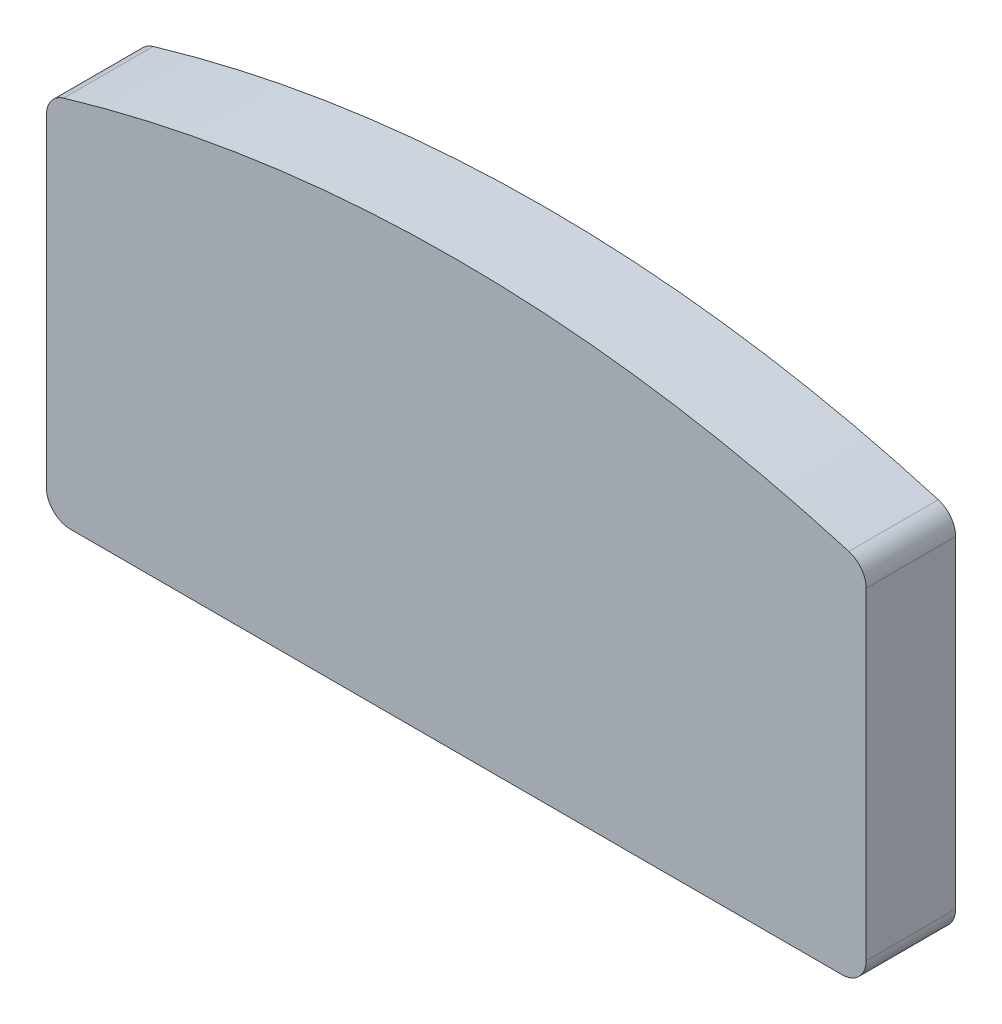
ISO-10303-21;
HEADER;
FILE_DESCRIPTION(('STEP AP214'),'2;1');
FILE_NAME('part.step','',(''),(''),'','','');
FILE_SCHEMA(('AUTOMOTIVE_DESIGN { 1 0 10303 214 1 1 1 1 }'));
ENDSEC;
DATA;
#1=APPLICATION_CONTEXT('core data for automotive mechanical design processes');
#2=APPLICATION_PROTOCOL_DEFINITION('international standard','automotive_design',2000,#1);
#3=PRODUCT_CONTEXT('',#1,'mechanical');
#4=PRODUCT('Part','Part','',(#3));
#5=PRODUCT_RELATED_PRODUCT_CATEGORY('part','',(#4));
#6=PRODUCT_DEFINITION_FORMATION('','',#4);
#7=PRODUCT_DEFINITION_CONTEXT('part definition',#1,'design');
#8=PRODUCT_DEFINITION('design','',#6,#7);
#9=PRODUCT_DEFINITION_SHAPE('','',#8);
#10=(LENGTH_UNIT() NAMED_UNIT(*) SI_UNIT(.MILLI.,.METRE.));
#11=(NAMED_UNIT(*) PLANE_ANGLE_UNIT() SI_UNIT($,.RADIAN.));
#12=(NAMED_UNIT(*) SI_UNIT($,.STERADIAN.) SOLID_ANGLE_UNIT());
#13=UNCERTAINTY_MEASURE_WITH_UNIT(LENGTH_MEASURE(1.E-05),#10,'distance_accuracy_value','');
#14=(GEOMETRIC_REPRESENTATION_CONTEXT(3) GLOBAL_UNCERTAINTY_ASSIGNED_CONTEXT((#13)) GLOBAL_UNIT_ASSIGNED_CONTEXT((#10,
#11,#12)) REPRESENTATION_CONTEXT('',''));
#15=CARTESIAN_POINT('',(0.,0.,0.));
#16=DIRECTION('',(0.,0.,1.));
#17=DIRECTION('',(1.,0.,0.));
#18=AXIS2_PLACEMENT_3D('',#15,#16,#17);
#19=CARTESIAN_POINT('',(-31.9,-38.4,-7.4));
#20=DIRECTION('',(0.,0.,1.));
#21=DIRECTION('',(1.,0.,0.));
#22=AXIS2_PLACEMENT_3D('',#19,#20,#21);
#23=CYLINDRICAL_SURFACE('',#22,2.00000000000001);
#24=CARTESIAN_POINT('',(-31.9,-38.4,0.));
#25=DIRECTION('',(0.,0.,-1.));
#26=DIRECTION('',(-1.,0.,0.));
#27=AXIS2_PLACEMENT_3D('',#24,#25,#26);
#28=CIRCLE('',#27,2.00000000000001);
#29=CARTESIAN_POINT('',(-31.9,-40.4,0.));
#30=VERTEX_POINT('',#29);
#31=CARTESIAN_POINT('',(-33.9,-38.4,0.));
#32=VERTEX_POINT('',#31);
#33=EDGE_CURVE('E104',#30,#32,#28,.T.);
#34=ORIENTED_EDGE('',*,*,#33,.T.);
#35=DIRECTION('',(0.,0.,1.));
#36=VECTOR('',#35,1.);
#37=CARTESIAN_POINT('',(-33.9,-38.4,-7.4));
#38=LINE('',#37,#36);
#39=CARTESIAN_POINT('',(-33.9,-38.4,-7.4));
#40=VERTEX_POINT('',#39);
#41=EDGE_CURVE('E11',#40,#32,#38,.T.);
#42=ORIENTED_EDGE('',*,*,#41,.F.);
#43=CARTESIAN_POINT('',(-31.9,-38.4,-7.4));
#44=DIRECTION('',(0.,0.,-1.));
#45=DIRECTION('',(-1.,0.,0.));
#46=AXIS2_PLACEMENT_3D('',#43,#44,#45);
#47=CIRCLE('',#46,2.00000000000001);
#48=CARTESIAN_POINT('',(-31.9,-40.4,-7.4));
#49=VERTEX_POINT('',#48);
#50=EDGE_CURVE('E109',#49,#40,#47,.T.);
#51=ORIENTED_EDGE('',*,*,#50,.F.);
#52=DIRECTION('',(0.,0.,1.));
#53=VECTOR('',#52,1.);
#54=CARTESIAN_POINT('',(-31.9,-40.4,-7.4));
#55=LINE('',#54,#53);
#56=EDGE_CURVE('E122',#49,#30,#55,.T.);
#57=ORIENTED_EDGE('',*,*,#56,.T.);
#58=EDGE_LOOP('',(#34,#42,#51,#57));
#59=FACE_BOUND('',#58,.T.);
#60=ADVANCED_FACE('F38',(#59),#23,.T.);
#61=CARTESIAN_POINT('',(-33.9,-11.7178968021182,-7.4));
#62=DIRECTION('',(1.,0.,0.));
#63=DIRECTION('',(0.,1.,0.));
#64=AXIS2_PLACEMENT_3D('',#61,#62,#63);
#65=PLANE('',#64);
#66=DIRECTION('',(0.,1.,0.));
#67=VECTOR('',#66,1.);
#68=CARTESIAN_POINT('',(-33.9,-11.7178968021182,0.));
#69=LINE('',#68,#67);
#70=CARTESIAN_POINT('',(-33.9,-11.7178968021182,0.));
#71=VERTEX_POINT('',#70);
#72=EDGE_CURVE('E148',#32,#71,#69,.T.);
#73=ORIENTED_EDGE('',*,*,#72,.T.);
#74=DIRECTION('',(0.,0.,1.));
#75=VECTOR('',#74,1.);
#76=CARTESIAN_POINT('',(-33.9,-11.7178968021182,-7.4));
#77=LINE('',#76,#75);
#78=CARTESIAN_POINT('',(-33.9,-11.7178968021182,-7.4));
#79=VERTEX_POINT('',#78);
#80=EDGE_CURVE('E46',#79,#71,#77,.T.);
#81=ORIENTED_EDGE('',*,*,#80,.F.);
#82=DIRECTION('',(0.,1.,0.));
#83=VECTOR('',#82,1.);
#84=CARTESIAN_POINT('',(-33.9,-11.7178968021182,-7.4));
#85=LINE('',#84,#83);
#86=EDGE_CURVE('E147',#40,#79,#85,.T.);
#87=ORIENTED_EDGE('',*,*,#86,.F.);
#88=ORIENTED_EDGE('',*,*,#41,.T.);
#89=EDGE_LOOP('',(#73,#81,#87,#88));
#90=FACE_BOUND('',#89,.T.);
#91=ADVANCED_FACE('F146',(#90),#65,.F.);
#92=CARTESIAN_POINT('',(-31.9,-11.7178968021182,-7.4));
#93=DIRECTION('',(0.,0.,1.));
#94=DIRECTION('',(1.,0.,0.));
#95=AXIS2_PLACEMENT_3D('',#92,#93,#94);
#96=CYLINDRICAL_SURFACE('',#95,2.);
#97=CARTESIAN_POINT('',(-31.9,-11.7178968021182,0.));
#98=DIRECTION('',(0.,0.,-1.));
#99=DIRECTION('',(1.,0.,0.));
#100=AXIS2_PLACEMENT_3D('',#97,#98,#99);
#101=CIRCLE('',#100,2.);
#102=CARTESIAN_POINT('',(-32.4671612261295,-9.8,0.));
#103=VERTEX_POINT('',#102);
#104=EDGE_CURVE('E142',#71,#103,#101,.T.);
#105=ORIENTED_EDGE('',*,*,#104,.T.);
#106=DIRECTION('',(0.,0.,1.));
#107=VECTOR('',#106,1.);
#108=CARTESIAN_POINT('',(-32.4671612261295,-9.79999999999999,-7.4));
#109=LINE('',#108,#107);
#110=CARTESIAN_POINT('',(-32.4671612261295,-9.79999999999999,-7.4));
#111=VERTEX_POINT('',#110);
#112=EDGE_CURVE('E133',#111,#103,#109,.T.);
#113=ORIENTED_EDGE('',*,*,#112,.F.);
#114=CARTESIAN_POINT('',(-31.9,-11.7178968021182,-7.4));
#115=DIRECTION('',(0.,0.,-1.));
#116=DIRECTION('',(1.,0.,0.));
#117=AXIS2_PLACEMENT_3D('',#114,#115,#116);
#118=CIRCLE('',#117,2.);
#119=EDGE_CURVE('E143',#79,#111,#118,.T.);
#120=ORIENTED_EDGE('',*,*,#119,.F.);
#121=ORIENTED_EDGE('',*,*,#80,.T.);
#122=EDGE_LOOP('',(#105,#113,#120,#121));
#123=FACE_BOUND('',#122,.T.);
#124=ADVANCED_FACE('F140',(#123),#96,.T.);
#125=CARTESIAN_POINT('',(0.,-119.590059370584,-7.4));
#126=DIRECTION('',(0.,0.,1.));
#127=DIRECTION('',(1.,0.,0.));
#128=AXIS2_PLACEMENT_3D('',#125,#126,#127);
#129=CYLINDRICAL_SURFACE('',#128,114.490059370584);
#130=CARTESIAN_POINT('',(0.,-119.590059370584,0.));
#131=DIRECTION('',(0.,0.,-1.));
#132=DIRECTION('',(1.,0.,0.));
#133=AXIS2_PLACEMENT_3D('',#130,#131,#132);
#134=CIRCLE('',#133,114.490059370584);
#135=CARTESIAN_POINT('',(32.4671612261295,-9.8,0.));
#136=VERTEX_POINT('',#135);
#137=EDGE_CURVE('E153',#103,#136,#134,.T.);
#138=ORIENTED_EDGE('',*,*,#137,.T.);
#139=DIRECTION('',(0.,0.,1.));
#140=VECTOR('',#139,1.);
#141=CARTESIAN_POINT('',(32.4671612261295,-9.8,-7.4));
#142=LINE('',#141,#140);
#143=CARTESIAN_POINT('',(32.4671612261295,-9.8,-7.4));
#144=VERTEX_POINT('',#143);
#145=EDGE_CURVE('E130',#144,#136,#142,.T.);
#146=ORIENTED_EDGE('',*,*,#145,.F.);
#147=CARTESIAN_POINT('',(0.,-119.590059370584,-7.4));
#148=DIRECTION('',(0.,0.,-1.));
#149=DIRECTION('',(1.,0.,0.));
#150=AXIS2_PLACEMENT_3D('',#147,#148,#149);
#151=CIRCLE('',#150,114.490059370584);
#152=EDGE_CURVE('E176',#111,#144,#151,.T.);
#153=ORIENTED_EDGE('',*,*,#152,.F.);
#154=ORIENTED_EDGE('',*,*,#112,.T.);
#155=EDGE_LOOP('',(#138,#146,#153,#154));
#156=FACE_BOUND('',#155,.T.);
#157=ADVANCED_FACE('F175',(#156),#129,.T.);
#158=CARTESIAN_POINT('',(31.9,-11.7178968021182,-7.4));
#159=DIRECTION('',(0.,0.,1.));
#160=DIRECTION('',(1.,0.,0.));
#161=AXIS2_PLACEMENT_3D('',#158,#159,#160);
#162=CYLINDRICAL_SURFACE('',#161,2.);
#163=CARTESIAN_POINT('',(31.9,-11.7178968021182,0.));
#164=DIRECTION('',(0.,0.,-1.));
#165=DIRECTION('',(-1.,0.,0.));
#166=AXIS2_PLACEMENT_3D('',#163,#164,#165);
#167=CIRCLE('',#166,2.);
#168=CARTESIAN_POINT('',(33.9,-11.7178968021182,0.));
#169=VERTEX_POINT('',#168);
#170=EDGE_CURVE('E161',#136,#169,#167,.T.);
#171=ORIENTED_EDGE('',*,*,#170,.T.);
#172=DIRECTION('',(0.,0.,1.));
#173=VECTOR('',#172,1.);
#174=CARTESIAN_POINT('',(33.9,-11.7178968021182,-7.4));
#175=LINE('',#174,#173);
#176=CARTESIAN_POINT('',(33.9,-11.7178968021182,-7.4));
#177=VERTEX_POINT('',#176);
#178=EDGE_CURVE('E124',#177,#169,#175,.T.);
#179=ORIENTED_EDGE('',*,*,#178,.F.);
#180=CARTESIAN_POINT('',(31.9,-11.7178968021182,-7.4));
#181=DIRECTION('',(0.,0.,-1.));
#182=DIRECTION('',(-1.,0.,0.));
#183=AXIS2_PLACEMENT_3D('',#180,#181,#182);
#184=CIRCLE('',#183,2.);
#185=EDGE_CURVE('E172',#144,#177,#184,.T.);
#186=ORIENTED_EDGE('',*,*,#185,.F.);
#187=ORIENTED_EDGE('',*,*,#145,.T.);
#188=EDGE_LOOP('',(#171,#179,#186,#187));
#189=FACE_BOUND('',#188,.T.);
#190=ADVANCED_FACE('F169',(#189),#162,.T.);
#191=CARTESIAN_POINT('',(33.9,-11.7178968021182,-7.4));
#192=DIRECTION('',(-1.,0.,0.));
#193=DIRECTION('',(0.,-1.,0.));
#194=AXIS2_PLACEMENT_3D('',#191,#192,#193);
#195=PLANE('',#194);
#196=DIRECTION('',(0.,-1.,0.));
#197=VECTOR('',#196,1.);
#198=CARTESIAN_POINT('',(33.9,-11.7178968021182,0.));
#199=LINE('',#198,#197);
#200=CARTESIAN_POINT('',(33.9,-38.4,0.));
#201=VERTEX_POINT('',#200);
#202=EDGE_CURVE('E119',#169,#201,#199,.T.);
#203=ORIENTED_EDGE('',*,*,#202,.T.);
#204=DIRECTION('',(0.,0.,1.));
#205=VECTOR('',#204,1.);
#206=CARTESIAN_POINT('',(33.9,-38.4,-7.4));
#207=LINE('',#206,#205);
#208=CARTESIAN_POINT('',(33.9,-38.4,-7.4));
#209=VERTEX_POINT('',#208);
#210=EDGE_CURVE('E118',#209,#201,#207,.T.);
#211=ORIENTED_EDGE('',*,*,#210,.F.);
#212=DIRECTION('',(0.,-1.,0.));
#213=VECTOR('',#212,1.);
#214=CARTESIAN_POINT('',(33.9,-11.7178968021182,-7.4));
#215=LINE('',#214,#213);
#216=EDGE_CURVE('E178',#177,#209,#215,.T.);
#217=ORIENTED_EDGE('',*,*,#216,.F.);
#218=ORIENTED_EDGE('',*,*,#178,.T.);
#219=EDGE_LOOP('',(#203,#211,#217,#218));
#220=FACE_BOUND('',#219,.T.);
#221=ADVANCED_FACE('F165',(#220),#195,.F.);
#222=CARTESIAN_POINT('',(31.9,-38.4,-7.4));
#223=DIRECTION('',(0.,0.,1.));
#224=DIRECTION('',(1.,0.,0.));
#225=AXIS2_PLACEMENT_3D('',#222,#223,#224);
#226=CYLINDRICAL_SURFACE('',#225,2.00000000000001);
#227=CARTESIAN_POINT('',(31.9,-38.4,0.));
#228=DIRECTION('',(0.,0.,-1.));
#229=DIRECTION('',(-1.,0.,0.));
#230=AXIS2_PLACEMENT_3D('',#227,#228,#229);
#231=CIRCLE('',#230,2.00000000000001);
#232=CARTESIAN_POINT('',(31.9,-40.4,0.));
#233=VERTEX_POINT('',#232);
#234=EDGE_CURVE('E101',#201,#233,#231,.T.);
#235=ORIENTED_EDGE('',*,*,#234,.T.);
#236=DIRECTION('',(0.,0.,1.));
#237=VECTOR('',#236,1.);
#238=CARTESIAN_POINT('',(31.9,-40.4,-7.4));
#239=LINE('',#238,#237);
#240=CARTESIAN_POINT('',(31.9,-40.4,-7.4));
#241=VERTEX_POINT('',#240);
#242=EDGE_CURVE('E116',#241,#233,#239,.T.);
#243=ORIENTED_EDGE('',*,*,#242,.F.);
#244=CARTESIAN_POINT('',(31.9,-38.4,-7.4));
#245=DIRECTION('',(0.,0.,-1.));
#246=DIRECTION('',(-1.,0.,0.));
#247=AXIS2_PLACEMENT_3D('',#244,#245,#246);
#248=CIRCLE('',#247,2.00000000000001);
#249=EDGE_CURVE('E184',#209,#241,#248,.T.);
#250=ORIENTED_EDGE('',*,*,#249,.F.);
#251=ORIENTED_EDGE('',*,*,#210,.T.);
#252=EDGE_LOOP('',(#235,#243,#250,#251));
#253=FACE_BOUND('',#252,.T.);
#254=ADVANCED_FACE('F114',(#253),#226,.T.);
#255=CARTESIAN_POINT('',(31.9,-40.4,-7.4));
#256=DIRECTION('',(0.,1.,0.));
#257=DIRECTION('',(0.,0.,1.));
#258=AXIS2_PLACEMENT_3D('',#255,#256,#257);
#259=PLANE('',#258);
#260=DIRECTION('',(-1.,0.,0.));
#261=VECTOR('',#260,1.);
#262=CARTESIAN_POINT('',(31.9,-40.4,0.));
#263=LINE('',#262,#261);
#264=EDGE_CURVE('E98',#233,#30,#263,.T.);
#265=ORIENTED_EDGE('',*,*,#264,.T.);
#266=ORIENTED_EDGE('',*,*,#56,.F.);
#267=DIRECTION('',(-1.,0.,0.));
#268=VECTOR('',#267,1.);
#269=CARTESIAN_POINT('',(31.9,-40.4,-7.4));
#270=LINE('',#269,#268);
#271=EDGE_CURVE('E53',#241,#49,#270,.T.);
#272=ORIENTED_EDGE('',*,*,#271,.F.);
#273=ORIENTED_EDGE('',*,*,#242,.T.);
#274=EDGE_LOOP('',(#265,#266,#272,#273));
#275=FACE_BOUND('',#274,.T.);
#276=ADVANCED_FACE('F121',(#275),#259,.F.);
#277=CARTESIAN_POINT('',(-31.9,-38.4,-7.4));
#278=DIRECTION('',(0.,0.,-1.));
#279=DIRECTION('',(-1.,0.,0.));
#280=AXIS2_PLACEMENT_3D('',#277,#278,#279);
#281=PLANE('',#280);
#282=ORIENTED_EDGE('',*,*,#50,.T.);
#283=ORIENTED_EDGE('',*,*,#86,.T.);
#284=ORIENTED_EDGE('',*,*,#119,.T.);
#285=ORIENTED_EDGE('',*,*,#152,.T.);
#286=ORIENTED_EDGE('',*,*,#185,.T.);
#287=ORIENTED_EDGE('',*,*,#216,.T.);
#288=ORIENTED_EDGE('',*,*,#249,.T.);
#289=ORIENTED_EDGE('',*,*,#271,.T.);
#290=EDGE_LOOP('',(#282,#283,#284,#285,#286,#287,#288,#289));
#291=FACE_BOUND('',#290,.T.);
#292=ADVANCED_FACE('F185',(#291),#281,.T.);
#293=CARTESIAN_POINT('',(0.,0.,0.));
#294=DIRECTION('',(0.,0.,1.));
#295=DIRECTION('',(1.,0.,0.));
#296=AXIS2_PLACEMENT_3D('',#293,#294,#295);
#297=PLANE('',#296);
#298=ORIENTED_EDGE('',*,*,#33,.F.);
#299=ORIENTED_EDGE('',*,*,#264,.F.);
#300=ORIENTED_EDGE('',*,*,#234,.F.);
#301=ORIENTED_EDGE('',*,*,#202,.F.);
#302=ORIENTED_EDGE('',*,*,#170,.F.);
#303=ORIENTED_EDGE('',*,*,#137,.F.);
#304=ORIENTED_EDGE('',*,*,#104,.F.);
#305=ORIENTED_EDGE('',*,*,#72,.F.);
#306=EDGE_LOOP('',(#298,#299,#300,#301,#302,#303,#304,#305));
#307=FACE_BOUND('',#306,.T.);
#308=ADVANCED_FACE('F100',(#307),#297,.T.);
#309=CLOSED_SHELL('',(#60,#91,#124,#157,#190,#221,#254,#276,#292,#308));
#310=MANIFOLD_SOLID_BREP('B2',#309);
#311=ADVANCED_BREP_SHAPE_REPRESENTATION('',(#18,#310),#14);
#312=SHAPE_DEFINITION_REPRESENTATION(#9,#311);
ENDSEC;
END-ISO-10303-21;
